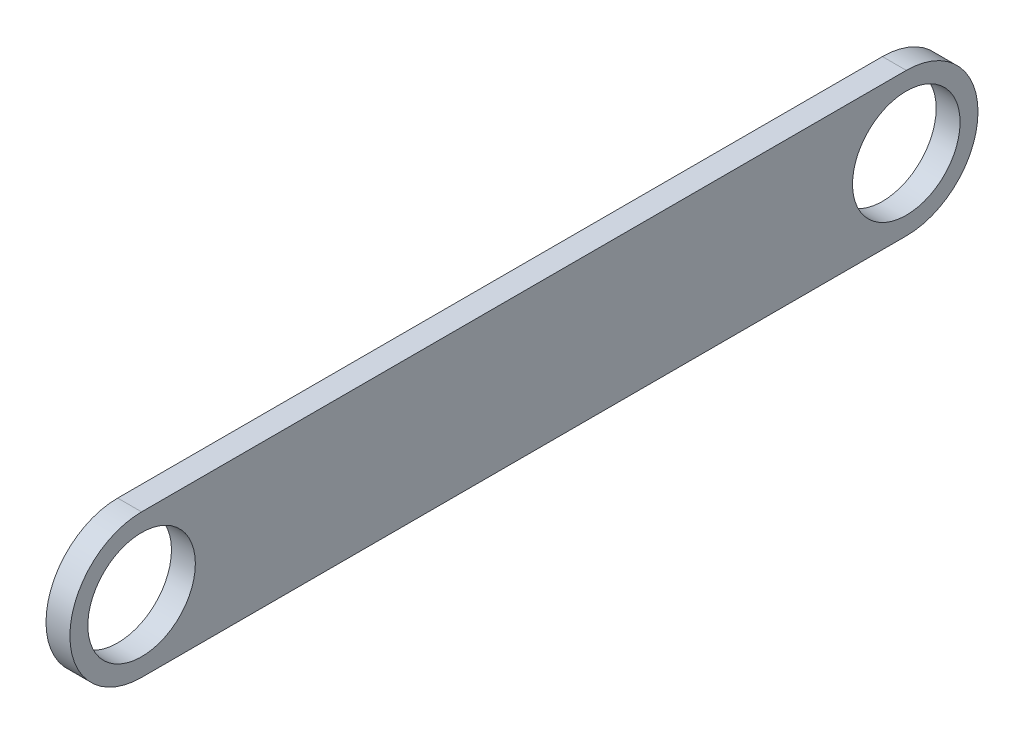
ISO-10303-21;
HEADER;
FILE_DESCRIPTION(('STEP AP214'),'2;1');
FILE_NAME('part.step','',(''),(''),'','','');
FILE_SCHEMA(('AUTOMOTIVE_DESIGN { 1 0 10303 214 1 1 1 1 }'));
ENDSEC;
DATA;
#1=APPLICATION_CONTEXT('core data for automotive mechanical design processes');
#2=APPLICATION_PROTOCOL_DEFINITION('international standard','automotive_design',2000,#1);
#3=PRODUCT_CONTEXT('',#1,'mechanical');
#4=PRODUCT('Part','Part','',(#3));
#5=PRODUCT_RELATED_PRODUCT_CATEGORY('part','',(#4));
#6=PRODUCT_DEFINITION_FORMATION('','',#4);
#7=PRODUCT_DEFINITION_CONTEXT('part definition',#1,'design');
#8=PRODUCT_DEFINITION('design','',#6,#7);
#9=PRODUCT_DEFINITION_SHAPE('','',#8);
#10=(LENGTH_UNIT() NAMED_UNIT(*) SI_UNIT(.MILLI.,.METRE.));
#11=(NAMED_UNIT(*) PLANE_ANGLE_UNIT() SI_UNIT($,.RADIAN.));
#12=(NAMED_UNIT(*) SI_UNIT($,.STERADIAN.) SOLID_ANGLE_UNIT());
#13=UNCERTAINTY_MEASURE_WITH_UNIT(LENGTH_MEASURE(1.E-05),#10,'distance_accuracy_value','');
#14=(GEOMETRIC_REPRESENTATION_CONTEXT(3) GLOBAL_UNCERTAINTY_ASSIGNED_CONTEXT((#13)) GLOBAL_UNIT_ASSIGNED_CONTEXT((#10,
#11,#12)) REPRESENTATION_CONTEXT('',''));
#15=CARTESIAN_POINT('',(0.,0.,0.));
#16=DIRECTION('',(0.,0.,1.));
#17=DIRECTION('',(1.,0.,0.));
#18=AXIS2_PLACEMENT_3D('',#15,#16,#17);
#19=CARTESIAN_POINT('',(6.35,0.,0.));
#20=DIRECTION('',(1.,0.,0.));
#21=DIRECTION('',(0.,0.,-1.));
#22=AXIS2_PLACEMENT_3D('',#19,#20,#21);
#23=PLANE('',#22);
#24=CARTESIAN_POINT('',(6.35,0.,0.));
#25=DIRECTION('',(1.,0.,0.));
#26=DIRECTION('',(0.,0.,-1.));
#27=AXIS2_PLACEMENT_3D('',#24,#25,#26);
#28=CIRCLE('',#27,14.2875);
#29=CARTESIAN_POINT('',(6.35,0.,-14.2875));
#30=VERTEX_POINT('',#29);
#31=EDGE_CURVE('E101',#30,#30,#28,.T.);
#32=ORIENTED_EDGE('',*,*,#31,.F.);
#33=EDGE_LOOP('',(#32));
#34=FACE_BOUND('',#33,.T.);
#35=CARTESIAN_POINT('',(6.35,0.,0.));
#36=DIRECTION('',(1.,0.,0.));
#37=DIRECTION('',(0.,0.,-1.));
#38=AXIS2_PLACEMENT_3D('',#35,#36,#37);
#39=CIRCLE('',#38,19.05);
#40=CARTESIAN_POINT('',(6.35,19.05,0.));
#41=VERTEX_POINT('',#40);
#42=CARTESIAN_POINT('',(6.35,-19.05,0.));
#43=VERTEX_POINT('',#42);
#44=EDGE_CURVE('E86',#41,#43,#39,.T.);
#45=ORIENTED_EDGE('',*,*,#44,.T.);
#46=DIRECTION('',(0.,0.,-1.));
#47=VECTOR('',#46,1.);
#48=CARTESIAN_POINT('',(6.35,-19.05,0.));
#49=LINE('',#48,#47);
#50=CARTESIAN_POINT('',(6.35,-19.05,-203.2));
#51=VERTEX_POINT('',#50);
#52=EDGE_CURVE('E81',#43,#51,#49,.T.);
#53=ORIENTED_EDGE('',*,*,#52,.T.);
#54=CARTESIAN_POINT('',(6.35,0.,-203.2));
#55=DIRECTION('',(1.,0.,0.));
#56=DIRECTION('',(0.,0.,-1.));
#57=AXIS2_PLACEMENT_3D('',#54,#55,#56);
#58=CIRCLE('',#57,19.05);
#59=CARTESIAN_POINT('',(6.35,19.05,-203.2));
#60=VERTEX_POINT('',#59);
#61=EDGE_CURVE('E84',#51,#60,#58,.T.);
#62=ORIENTED_EDGE('',*,*,#61,.T.);
#63=DIRECTION('',(0.,0.,1.));
#64=VECTOR('',#63,1.);
#65=CARTESIAN_POINT('',(6.35,19.05,0.));
#66=LINE('',#65,#64);
#67=EDGE_CURVE('E51',#60,#41,#66,.T.);
#68=ORIENTED_EDGE('',*,*,#67,.T.);
#69=EDGE_LOOP('',(#45,#53,#62,#68));
#70=FACE_BOUND('',#69,.T.);
#71=CARTESIAN_POINT('',(6.35,0.,-203.2));
#72=DIRECTION('',(1.,0.,0.));
#73=DIRECTION('',(0.,0.,-1.));
#74=AXIS2_PLACEMENT_3D('',#71,#72,#73);
#75=CIRCLE('',#74,14.2875);
#76=CARTESIAN_POINT('',(6.35,0.,-217.4875));
#77=VERTEX_POINT('',#76);
#78=EDGE_CURVE('E116',#77,#77,#75,.T.);
#79=ORIENTED_EDGE('',*,*,#78,.F.);
#80=EDGE_LOOP('',(#79));
#81=FACE_BOUND('',#80,.T.);
#82=ADVANCED_FACE('F34',(#34,#70,#81),#23,.T.);
#83=CARTESIAN_POINT('',(0.,0.,0.));
#84=DIRECTION('',(1.,0.,0.));
#85=DIRECTION('',(0.,0.,-1.));
#86=AXIS2_PLACEMENT_3D('',#83,#84,#85);
#87=PLANE('',#86);
#88=CARTESIAN_POINT('',(0.,0.,0.));
#89=DIRECTION('',(1.,0.,0.));
#90=DIRECTION('',(0.,0.,-1.));
#91=AXIS2_PLACEMENT_3D('',#88,#89,#90);
#92=CIRCLE('',#91,19.05);
#93=CARTESIAN_POINT('',(0.,19.05,0.));
#94=VERTEX_POINT('',#93);
#95=CARTESIAN_POINT('',(0.,-19.05,0.));
#96=VERTEX_POINT('',#95);
#97=EDGE_CURVE('E98',#94,#96,#92,.T.);
#98=ORIENTED_EDGE('',*,*,#97,.F.);
#99=DIRECTION('',(0.,0.,1.));
#100=VECTOR('',#99,1.);
#101=CARTESIAN_POINT('',(0.,19.05,0.));
#102=LINE('',#101,#100);
#103=CARTESIAN_POINT('',(0.,19.05,-203.2));
#104=VERTEX_POINT('',#103);
#105=EDGE_CURVE('E74',#104,#94,#102,.T.);
#106=ORIENTED_EDGE('',*,*,#105,.F.);
#107=CARTESIAN_POINT('',(0.,0.,-203.2));
#108=DIRECTION('',(1.,0.,0.));
#109=DIRECTION('',(0.,0.,-1.));
#110=AXIS2_PLACEMENT_3D('',#107,#108,#109);
#111=CIRCLE('',#110,19.05);
#112=CARTESIAN_POINT('',(0.,-19.05,-203.2));
#113=VERTEX_POINT('',#112);
#114=EDGE_CURVE('E68',#113,#104,#111,.T.);
#115=ORIENTED_EDGE('',*,*,#114,.F.);
#116=DIRECTION('',(0.,0.,-1.));
#117=VECTOR('',#116,1.);
#118=CARTESIAN_POINT('',(0.,-19.05,0.));
#119=LINE('',#118,#117);
#120=EDGE_CURVE('E90',#96,#113,#119,.T.);
#121=ORIENTED_EDGE('',*,*,#120,.F.);
#122=EDGE_LOOP('',(#98,#106,#115,#121));
#123=FACE_BOUND('',#122,.T.);
#124=CARTESIAN_POINT('',(0.,0.,0.));
#125=DIRECTION('',(1.,0.,0.));
#126=DIRECTION('',(0.,0.,-1.));
#127=AXIS2_PLACEMENT_3D('',#124,#125,#126);
#128=CIRCLE('',#127,14.2875);
#129=CARTESIAN_POINT('',(0.,0.,-14.2875));
#130=VERTEX_POINT('',#129);
#131=EDGE_CURVE('E113',#130,#130,#128,.T.);
#132=ORIENTED_EDGE('',*,*,#131,.T.);
#133=EDGE_LOOP('',(#132));
#134=FACE_BOUND('',#133,.T.);
#135=CARTESIAN_POINT('',(0.,0.,-203.2));
#136=DIRECTION('',(1.,0.,0.));
#137=DIRECTION('',(0.,0.,-1.));
#138=AXIS2_PLACEMENT_3D('',#135,#136,#137);
#139=CIRCLE('',#138,14.2875);
#140=CARTESIAN_POINT('',(0.,0.,-217.4875));
#141=VERTEX_POINT('',#140);
#142=EDGE_CURVE('E119',#141,#141,#139,.T.);
#143=ORIENTED_EDGE('',*,*,#142,.T.);
#144=EDGE_LOOP('',(#143));
#145=FACE_BOUND('',#144,.T.);
#146=ADVANCED_FACE('F109',(#123,#134,#145),#87,.F.);
#147=CARTESIAN_POINT('',(6.35,0.,0.));
#148=DIRECTION('',(-1.,0.,0.));
#149=DIRECTION('',(0.,0.,1.));
#150=AXIS2_PLACEMENT_3D('',#147,#148,#149);
#151=CYLINDRICAL_SURFACE('',#150,19.05);
#152=ORIENTED_EDGE('',*,*,#97,.T.);
#153=DIRECTION('',(-1.,0.,0.));
#154=VECTOR('',#153,1.);
#155=CARTESIAN_POINT('',(6.35,-19.05,0.));
#156=LINE('',#155,#154);
#157=EDGE_CURVE('E11',#43,#96,#156,.T.);
#158=ORIENTED_EDGE('',*,*,#157,.F.);
#159=ORIENTED_EDGE('',*,*,#44,.F.);
#160=DIRECTION('',(-1.,0.,0.));
#161=VECTOR('',#160,1.);
#162=CARTESIAN_POINT('',(6.35,19.05,0.));
#163=LINE('',#162,#161);
#164=EDGE_CURVE('E94',#41,#94,#163,.T.);
#165=ORIENTED_EDGE('',*,*,#164,.T.);
#166=EDGE_LOOP('',(#152,#158,#159,#165));
#167=FACE_BOUND('',#166,.T.);
#168=ADVANCED_FACE('F36',(#167),#151,.T.);
#169=CARTESIAN_POINT('',(6.35,-19.05,0.));
#170=DIRECTION('',(0.,1.,0.));
#171=DIRECTION('',(0.,0.,1.));
#172=AXIS2_PLACEMENT_3D('',#169,#170,#171);
#173=PLANE('',#172);
#174=ORIENTED_EDGE('',*,*,#120,.T.);
#175=DIRECTION('',(-1.,0.,0.));
#176=VECTOR('',#175,1.);
#177=CARTESIAN_POINT('',(6.35,-19.05,-203.2));
#178=LINE('',#177,#176);
#179=EDGE_CURVE('E43',#51,#113,#178,.T.);
#180=ORIENTED_EDGE('',*,*,#179,.F.);
#181=ORIENTED_EDGE('',*,*,#52,.F.);
#182=ORIENTED_EDGE('',*,*,#157,.T.);
#183=EDGE_LOOP('',(#174,#180,#181,#182));
#184=FACE_BOUND('',#183,.T.);
#185=ADVANCED_FACE('F89',(#184),#173,.F.);
#186=CARTESIAN_POINT('',(6.35,0.,-203.2));
#187=DIRECTION('',(-1.,0.,0.));
#188=DIRECTION('',(0.,0.,1.));
#189=AXIS2_PLACEMENT_3D('',#186,#187,#188);
#190=CYLINDRICAL_SURFACE('',#189,19.05);
#191=ORIENTED_EDGE('',*,*,#114,.T.);
#192=DIRECTION('',(-1.,0.,0.));
#193=VECTOR('',#192,1.);
#194=CARTESIAN_POINT('',(6.35,19.05,-203.2));
#195=LINE('',#194,#193);
#196=EDGE_CURVE('E91',#60,#104,#195,.T.);
#197=ORIENTED_EDGE('',*,*,#196,.F.);
#198=ORIENTED_EDGE('',*,*,#61,.F.);
#199=ORIENTED_EDGE('',*,*,#179,.T.);
#200=EDGE_LOOP('',(#191,#197,#198,#199));
#201=FACE_BOUND('',#200,.T.);
#202=ADVANCED_FACE('F92',(#201),#190,.T.);
#203=CARTESIAN_POINT('',(6.35,19.05,0.));
#204=DIRECTION('',(0.,-1.,0.));
#205=DIRECTION('',(0.,0.,-1.));
#206=AXIS2_PLACEMENT_3D('',#203,#204,#205);
#207=PLANE('',#206);
#208=ORIENTED_EDGE('',*,*,#105,.T.);
#209=ORIENTED_EDGE('',*,*,#164,.F.);
#210=ORIENTED_EDGE('',*,*,#67,.F.);
#211=ORIENTED_EDGE('',*,*,#196,.T.);
#212=EDGE_LOOP('',(#208,#209,#210,#211));
#213=FACE_BOUND('',#212,.T.);
#214=ADVANCED_FACE('F106',(#213),#207,.F.);
#215=CARTESIAN_POINT('',(6.35,0.,0.));
#216=DIRECTION('',(-1.,0.,0.));
#217=DIRECTION('',(0.,0.,1.));
#218=AXIS2_PLACEMENT_3D('',#215,#216,#217);
#219=CYLINDRICAL_SURFACE('',#218,14.2875);
#220=ORIENTED_EDGE('',*,*,#31,.T.);
#221=EDGE_LOOP('',(#220));
#222=FACE_BOUND('',#221,.T.);
#223=ORIENTED_EDGE('',*,*,#131,.F.);
#224=EDGE_LOOP('',(#223));
#225=FACE_BOUND('',#224,.T.);
#226=ADVANCED_FACE('F136',(#222,#225),#219,.F.);
#227=CARTESIAN_POINT('',(6.35,0.,-203.2));
#228=DIRECTION('',(-1.,0.,0.));
#229=DIRECTION('',(0.,0.,1.));
#230=AXIS2_PLACEMENT_3D('',#227,#228,#229);
#231=CYLINDRICAL_SURFACE('',#230,14.2875);
#232=ORIENTED_EDGE('',*,*,#78,.T.);
#233=EDGE_LOOP('',(#232));
#234=FACE_BOUND('',#233,.T.);
#235=ORIENTED_EDGE('',*,*,#142,.F.);
#236=EDGE_LOOP('',(#235));
#237=FACE_BOUND('',#236,.T.);
#238=ADVANCED_FACE('F125',(#234,#237),#231,.F.);
#239=CLOSED_SHELL('',(#82,#146,#168,#185,#202,#214,#226,#238));
#240=MANIFOLD_SOLID_BREP('B2',#239);
#241=ADVANCED_BREP_SHAPE_REPRESENTATION('',(#18,#240),#14);
#242=SHAPE_DEFINITION_REPRESENTATION(#9,#241);
ENDSEC;
END-ISO-10303-21;
